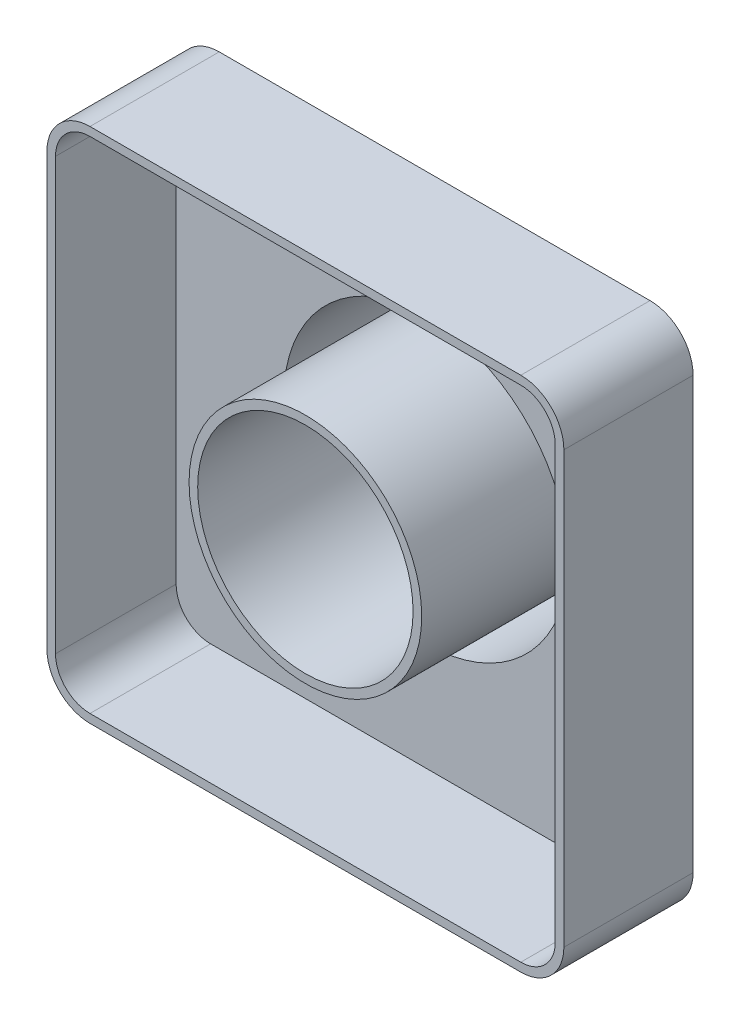
ISO-10303-21;
HEADER;
FILE_DESCRIPTION(('STEP AP214'),'2;1');
FILE_NAME('part.step','',(''),(''),'','','');
FILE_SCHEMA(('AUTOMOTIVE_DESIGN { 1 0 10303 214 1 1 1 1 }'));
ENDSEC;
DATA;
#1=APPLICATION_CONTEXT('core data for automotive mechanical design processes');
#2=APPLICATION_PROTOCOL_DEFINITION('international standard','automotive_design',2000,#1);
#3=PRODUCT_CONTEXT('',#1,'mechanical');
#4=PRODUCT('Part','Part','',(#3));
#5=PRODUCT_RELATED_PRODUCT_CATEGORY('part','',(#4));
#6=PRODUCT_DEFINITION_FORMATION('','',#4);
#7=PRODUCT_DEFINITION_CONTEXT('part definition',#1,'design');
#8=PRODUCT_DEFINITION('design','',#6,#7);
#9=PRODUCT_DEFINITION_SHAPE('','',#8);
#10=(LENGTH_UNIT() NAMED_UNIT(*) SI_UNIT(.MILLI.,.METRE.));
#11=(NAMED_UNIT(*) PLANE_ANGLE_UNIT() SI_UNIT($,.RADIAN.));
#12=(NAMED_UNIT(*) SI_UNIT($,.STERADIAN.) SOLID_ANGLE_UNIT());
#13=UNCERTAINTY_MEASURE_WITH_UNIT(LENGTH_MEASURE(1.E-05),#10,'distance_accuracy_value','');
#14=(GEOMETRIC_REPRESENTATION_CONTEXT(3) GLOBAL_UNCERTAINTY_ASSIGNED_CONTEXT((#13)) GLOBAL_UNIT_ASSIGNED_CONTEXT((#10,
#11,#12)) REPRESENTATION_CONTEXT('',''));
#15=CARTESIAN_POINT('',(0.,0.,0.));
#16=DIRECTION('',(0.,0.,1.));
#17=DIRECTION('',(1.,0.,0.));
#18=AXIS2_PLACEMENT_3D('',#15,#16,#17);
#19=CARTESIAN_POINT('',(0.,0.,30.));
#20=DIRECTION('',(0.,0.,-1.));
#21=DIRECTION('',(-1.,0.,0.));
#22=AXIS2_PLACEMENT_3D('',#19,#20,#21);
#23=PLANE('',#22);
#24=CARTESIAN_POINT('',(60.,60.,30.));
#25=DIRECTION('',(0.,0.,-1.));
#26=DIRECTION('',(-1.,0.,0.));
#27=AXIS2_PLACEMENT_3D('',#24,#25,#26);
#28=CIRCLE('',#27,27.);
#29=CARTESIAN_POINT('',(32.9999999999999,60.,30.));
#30=VERTEX_POINT('',#29);
#31=EDGE_CURVE('E206',#30,#30,#28,.T.);
#32=ORIENTED_EDGE('',*,*,#31,.F.);
#33=EDGE_LOOP('',(#32));
#34=FACE_BOUND('',#33,.T.);
#35=CARTESIAN_POINT('',(60.,60.,30.));
#36=DIRECTION('',(0.,0.,-1.));
#37=DIRECTION('',(-1.,0.,0.));
#38=AXIS2_PLACEMENT_3D('',#35,#36,#37);
#39=CIRCLE('',#38,25.);
#40=CARTESIAN_POINT('',(35.,60.,30.));
#41=VERTEX_POINT('',#40);
#42=EDGE_CURVE('E231',#41,#41,#39,.T.);
#43=ORIENTED_EDGE('',*,*,#42,.T.);
#44=EDGE_LOOP('',(#43));
#45=FACE_BOUND('',#44,.T.);
#46=ADVANCED_FACE('F39',(#34,#45),#23,.F.);
#47=CARTESIAN_POINT('',(0.,0.,30.));
#48=DIRECTION('',(1.,0.,0.));
#49=DIRECTION('',(0.,1.,0.));
#50=AXIS2_PLACEMENT_3D('',#47,#48,#49);
#51=PLANE('',#50);
#52=DIRECTION('',(0.,-1.,0.));
#53=VECTOR('',#52,1.);
#54=CARTESIAN_POINT('',(0.,0.,30.));
#55=LINE('',#54,#53);
#56=CARTESIAN_POINT('',(0.,110.,30.));
#57=VERTEX_POINT('',#56);
#58=CARTESIAN_POINT('',(0.,10.,30.));
#59=VERTEX_POINT('',#58);
#60=EDGE_CURVE('E245',#57,#59,#55,.T.);
#61=ORIENTED_EDGE('',*,*,#60,.F.);
#62=DIRECTION('',(0.,0.,-1.));
#63=VECTOR('',#62,1.);
#64=CARTESIAN_POINT('',(0.,110.,30.));
#65=LINE('',#64,#63);
#66=CARTESIAN_POINT('',(0.,110.,0.));
#67=VERTEX_POINT('',#66);
#68=EDGE_CURVE('E281',#57,#67,#65,.T.);
#69=ORIENTED_EDGE('',*,*,#68,.T.);
#70=DIRECTION('',(0.,-1.,0.));
#71=VECTOR('',#70,1.);
#72=CARTESIAN_POINT('',(0.,0.,0.));
#73=LINE('',#72,#71);
#74=CARTESIAN_POINT('',(0.,10.,0.));
#75=VERTEX_POINT('',#74);
#76=EDGE_CURVE('E241',#67,#75,#73,.T.);
#77=ORIENTED_EDGE('',*,*,#76,.T.);
#78=DIRECTION('',(0.,0.,-1.));
#79=VECTOR('',#78,1.);
#80=CARTESIAN_POINT('',(0.,10.,30.));
#81=LINE('',#80,#79);
#82=EDGE_CURVE('E261',#75,#59,#81,.F.);
#83=ORIENTED_EDGE('',*,*,#82,.T.);
#84=EDGE_LOOP('',(#61,#69,#77,#83));
#85=FACE_BOUND('',#84,.T.);
#86=ADVANCED_FACE('F396',(#85),#51,.F.);
#87=CARTESIAN_POINT('',(0.,0.,30.));
#88=DIRECTION('',(0.,1.,0.));
#89=DIRECTION('',(0.,0.,1.));
#90=AXIS2_PLACEMENT_3D('',#87,#88,#89);
#91=PLANE('',#90);
#92=DIRECTION('',(1.,0.,0.));
#93=VECTOR('',#92,1.);
#94=CARTESIAN_POINT('',(0.,0.,30.));
#95=LINE('',#94,#93);
#96=CARTESIAN_POINT('',(10.,0.,30.));
#97=VERTEX_POINT('',#96);
#98=CARTESIAN_POINT('',(110.,0.,30.));
#99=VERTEX_POINT('',#98);
#100=EDGE_CURVE('E249',#97,#99,#95,.T.);
#101=ORIENTED_EDGE('',*,*,#100,.F.);
#102=DIRECTION('',(0.,0.,-1.));
#103=VECTOR('',#102,1.);
#104=CARTESIAN_POINT('',(10.,0.,30.));
#105=LINE('',#104,#103);
#106=CARTESIAN_POINT('',(10.,0.,0.));
#107=VERTEX_POINT('',#106);
#108=EDGE_CURVE('E319',#97,#107,#105,.T.);
#109=ORIENTED_EDGE('',*,*,#108,.T.);
#110=DIRECTION('',(1.,0.,0.));
#111=VECTOR('',#110,1.);
#112=CARTESIAN_POINT('',(0.,0.,0.));
#113=LINE('',#112,#111);
#114=CARTESIAN_POINT('',(110.,0.,0.));
#115=VERTEX_POINT('',#114);
#116=EDGE_CURVE('E265',#107,#115,#113,.T.);
#117=ORIENTED_EDGE('',*,*,#116,.T.);
#118=DIRECTION('',(0.,0.,-1.));
#119=VECTOR('',#118,1.);
#120=CARTESIAN_POINT('',(110.,0.,30.));
#121=LINE('',#120,#119);
#122=EDGE_CURVE('E316',#115,#99,#121,.F.);
#123=ORIENTED_EDGE('',*,*,#122,.T.);
#124=EDGE_LOOP('',(#101,#109,#117,#123));
#125=FACE_BOUND('',#124,.T.);
#126=ADVANCED_FACE('F407',(#125),#91,.F.);
#127=CARTESIAN_POINT('',(120.,0.,30.));
#128=DIRECTION('',(-1.,0.,0.));
#129=DIRECTION('',(0.,-1.,0.));
#130=AXIS2_PLACEMENT_3D('',#127,#128,#129);
#131=PLANE('',#130);
#132=DIRECTION('',(0.,1.,0.));
#133=VECTOR('',#132,1.);
#134=CARTESIAN_POINT('',(120.,0.,30.));
#135=LINE('',#134,#133);
#136=CARTESIAN_POINT('',(120.,10.,30.));
#137=VERTEX_POINT('',#136);
#138=CARTESIAN_POINT('',(120.,110.,30.));
#139=VERTEX_POINT('',#138);
#140=EDGE_CURVE('E254',#137,#139,#135,.T.);
#141=ORIENTED_EDGE('',*,*,#140,.F.);
#142=DIRECTION('',(0.,0.,-1.));
#143=VECTOR('',#142,1.);
#144=CARTESIAN_POINT('',(120.,10.,30.));
#145=LINE('',#144,#143);
#146=CARTESIAN_POINT('',(120.,10.,0.));
#147=VERTEX_POINT('',#146);
#148=EDGE_CURVE('E11',#137,#147,#145,.T.);
#149=ORIENTED_EDGE('',*,*,#148,.T.);
#150=DIRECTION('',(0.,1.,0.));
#151=VECTOR('',#150,1.);
#152=CARTESIAN_POINT('',(120.,0.,0.));
#153=LINE('',#152,#151);
#154=CARTESIAN_POINT('',(120.,110.,0.));
#155=VERTEX_POINT('',#154);
#156=EDGE_CURVE('E269',#147,#155,#153,.T.);
#157=ORIENTED_EDGE('',*,*,#156,.T.);
#158=DIRECTION('',(0.,0.,-1.));
#159=VECTOR('',#158,1.);
#160=CARTESIAN_POINT('',(120.,110.,30.));
#161=LINE('',#160,#159);
#162=EDGE_CURVE('E48',#155,#139,#161,.F.);
#163=ORIENTED_EDGE('',*,*,#162,.T.);
#164=EDGE_LOOP('',(#141,#149,#157,#163));
#165=FACE_BOUND('',#164,.T.);
#166=ADVANCED_FACE('F414',(#165),#131,.F.);
#167=CARTESIAN_POINT('',(0.,120.,30.));
#168=DIRECTION('',(0.,-1.,0.));
#169=DIRECTION('',(0.,0.,-1.));
#170=AXIS2_PLACEMENT_3D('',#167,#168,#169);
#171=PLANE('',#170);
#172=DIRECTION('',(-1.,0.,0.));
#173=VECTOR('',#172,1.);
#174=CARTESIAN_POINT('',(0.,120.,0.));
#175=LINE('',#174,#173);
#176=CARTESIAN_POINT('',(110.,120.,0.));
#177=VERTEX_POINT('',#176);
#178=CARTESIAN_POINT('',(9.99999999999996,120.,0.));
#179=VERTEX_POINT('',#178);
#180=EDGE_CURVE('E250',#177,#179,#175,.T.);
#181=ORIENTED_EDGE('',*,*,#180,.T.);
#182=DIRECTION('',(0.,0.,-1.));
#183=VECTOR('',#182,1.);
#184=CARTESIAN_POINT('',(9.99999999999996,120.,30.));
#185=LINE('',#184,#183);
#186=CARTESIAN_POINT('',(9.99999999999996,120.,30.));
#187=VERTEX_POINT('',#186);
#188=EDGE_CURVE('E301',#179,#187,#185,.F.);
#189=ORIENTED_EDGE('',*,*,#188,.T.);
#190=DIRECTION('',(-1.,0.,0.));
#191=VECTOR('',#190,1.);
#192=CARTESIAN_POINT('',(0.,120.,30.));
#193=LINE('',#192,#191);
#194=CARTESIAN_POINT('',(110.,120.,30.));
#195=VERTEX_POINT('',#194);
#196=EDGE_CURVE('E257',#195,#187,#193,.T.);
#197=ORIENTED_EDGE('',*,*,#196,.F.);
#198=DIRECTION('',(0.,0.,-1.));
#199=VECTOR('',#198,1.);
#200=CARTESIAN_POINT('',(110.,120.,30.));
#201=LINE('',#200,#199);
#202=EDGE_CURVE('E297',#195,#177,#201,.T.);
#203=ORIENTED_EDGE('',*,*,#202,.T.);
#204=EDGE_LOOP('',(#181,#189,#197,#203));
#205=FACE_BOUND('',#204,.T.);
#206=ADVANCED_FACE('F382',(#205),#171,.F.);
#207=DIRECTION('',(-1.,0.,0.));
#208=VECTOR('',#207,1.);
#209=CARTESIAN_POINT('',(0.,118.,30.));
#210=LINE('',#209,#208);
#211=CARTESIAN_POINT('',(110.,118.,30.));
#212=VERTEX_POINT('',#211);
#213=CARTESIAN_POINT('',(9.99999999999996,118.,30.));
#214=VERTEX_POINT('',#213);
#215=EDGE_CURVE('E184',#212,#214,#210,.T.);
#216=ORIENTED_EDGE('',*,*,#215,.F.);
#217=CARTESIAN_POINT('',(110.,110.,30.));
#218=DIRECTION('',(0.,0.,-1.));
#219=DIRECTION('',(-1.,0.,0.));
#220=AXIS2_PLACEMENT_3D('',#217,#218,#219);
#221=CIRCLE('',#220,8.);
#222=CARTESIAN_POINT('',(118.,110.,30.));
#223=VERTEX_POINT('',#222);
#224=EDGE_CURVE('E187',#223,#212,#221,.F.);
#225=ORIENTED_EDGE('',*,*,#224,.F.);
#226=DIRECTION('',(0.,1.,0.));
#227=VECTOR('',#226,1.);
#228=CARTESIAN_POINT('',(118.,0.,30.));
#229=LINE('',#228,#227);
#230=CARTESIAN_POINT('',(118.,10.,30.));
#231=VERTEX_POINT('',#230);
#232=EDGE_CURVE('E55',#231,#223,#229,.T.);
#233=ORIENTED_EDGE('',*,*,#232,.F.);
#234=CARTESIAN_POINT('',(110.,10.,30.));
#235=DIRECTION('',(0.,0.,-1.));
#236=DIRECTION('',(-1.,0.,0.));
#237=AXIS2_PLACEMENT_3D('',#234,#235,#236);
#238=CIRCLE('',#237,8.);
#239=CARTESIAN_POINT('',(110.,2.,30.));
#240=VERTEX_POINT('',#239);
#241=EDGE_CURVE('E191',#240,#231,#238,.F.);
#242=ORIENTED_EDGE('',*,*,#241,.F.);
#243=DIRECTION('',(1.,0.,0.));
#244=VECTOR('',#243,1.);
#245=CARTESIAN_POINT('',(0.,2.,30.));
#246=LINE('',#245,#244);
#247=CARTESIAN_POINT('',(10.,2.,30.));
#248=VERTEX_POINT('',#247);
#249=EDGE_CURVE('E210',#248,#240,#246,.T.);
#250=ORIENTED_EDGE('',*,*,#249,.F.);
#251=CARTESIAN_POINT('',(10.,10.,30.));
#252=DIRECTION('',(0.,0.,-1.));
#253=DIRECTION('',(-1.,0.,0.));
#254=AXIS2_PLACEMENT_3D('',#251,#252,#253);
#255=CIRCLE('',#254,8.);
#256=CARTESIAN_POINT('',(2.,10.,30.));
#257=VERTEX_POINT('',#256);
#258=EDGE_CURVE('E211',#257,#248,#255,.F.);
#259=ORIENTED_EDGE('',*,*,#258,.F.);
#260=DIRECTION('',(0.,-1.,0.));
#261=VECTOR('',#260,1.);
#262=CARTESIAN_POINT('',(2.,0.,30.));
#263=LINE('',#262,#261);
#264=CARTESIAN_POINT('',(1.99999999999996,110.,30.));
#265=VERTEX_POINT('',#264);
#266=EDGE_CURVE('E179',#265,#257,#263,.T.);
#267=ORIENTED_EDGE('',*,*,#266,.F.);
#268=CARTESIAN_POINT('',(9.99999999999996,110.,30.));
#269=DIRECTION('',(0.,0.,-1.));
#270=DIRECTION('',(-1.,0.,0.));
#271=AXIS2_PLACEMENT_3D('',#268,#269,#270);
#272=CIRCLE('',#271,8.);
#273=EDGE_CURVE('E214',#214,#265,#272,.F.);
#274=ORIENTED_EDGE('',*,*,#273,.F.);
#275=EDGE_LOOP('',(#216,#225,#233,#242,#250,#259,#267,#274));
#276=FACE_BOUND('',#275,.T.);
#277=ORIENTED_EDGE('',*,*,#196,.T.);
#278=CARTESIAN_POINT('',(9.99999999999996,110.,30.));
#279=DIRECTION('',(0.,0.,-1.));
#280=DIRECTION('',(-1.,0.,0.));
#281=AXIS2_PLACEMENT_3D('',#278,#279,#280);
#282=CIRCLE('',#281,10.);
#283=EDGE_CURVE('E313',#187,#57,#282,.F.);
#284=ORIENTED_EDGE('',*,*,#283,.T.);
#285=ORIENTED_EDGE('',*,*,#60,.T.);
#286=CARTESIAN_POINT('',(10.,10.,30.));
#287=DIRECTION('',(0.,0.,-1.));
#288=DIRECTION('',(-1.,0.,0.));
#289=AXIS2_PLACEMENT_3D('',#286,#287,#288);
#290=CIRCLE('',#289,10.);
#291=EDGE_CURVE('E310',#59,#97,#290,.F.);
#292=ORIENTED_EDGE('',*,*,#291,.T.);
#293=ORIENTED_EDGE('',*,*,#100,.T.);
#294=CARTESIAN_POINT('',(110.,10.,30.));
#295=DIRECTION('',(0.,0.,-1.));
#296=DIRECTION('',(-1.,0.,0.));
#297=AXIS2_PLACEMENT_3D('',#294,#295,#296);
#298=CIRCLE('',#297,10.);
#299=EDGE_CURVE('E307',#99,#137,#298,.F.);
#300=ORIENTED_EDGE('',*,*,#299,.T.);
#301=ORIENTED_EDGE('',*,*,#140,.T.);
#302=CARTESIAN_POINT('',(110.,110.,30.));
#303=DIRECTION('',(0.,0.,-1.));
#304=DIRECTION('',(-1.,0.,0.));
#305=AXIS2_PLACEMENT_3D('',#302,#303,#304);
#306=CIRCLE('',#305,10.);
#307=EDGE_CURVE('E304',#139,#195,#306,.F.);
#308=ORIENTED_EDGE('',*,*,#307,.T.);
#309=EDGE_LOOP('',(#277,#284,#285,#292,#293,#300,#301,#308));
#310=FACE_BOUND('',#309,.T.);
#311=ADVANCED_FACE('F378',(#276,#310),#23,.F.);
#312=CARTESIAN_POINT('',(0.,0.,0.));
#313=DIRECTION('',(0.,0.,-1.));
#314=DIRECTION('',(-1.,0.,0.));
#315=AXIS2_PLACEMENT_3D('',#312,#313,#314);
#316=PLANE('',#315);
#317=CARTESIAN_POINT('',(60.,60.,0.));
#318=DIRECTION('',(0.,0.,1.));
#319=DIRECTION('',(1.,0.,0.));
#320=AXIS2_PLACEMENT_3D('',#317,#318,#319);
#321=CIRCLE('',#320,35.);
#322=CARTESIAN_POINT('',(94.9999999999999,60.,0.));
#323=VERTEX_POINT('',#322);
#324=EDGE_CURVE('E235',#323,#323,#321,.T.);
#325=ORIENTED_EDGE('',*,*,#324,.T.);
#326=EDGE_LOOP('',(#325));
#327=FACE_BOUND('',#326,.T.);
#328=ORIENTED_EDGE('',*,*,#76,.F.);
#329=CARTESIAN_POINT('',(9.99999999999996,110.,0.));
#330=DIRECTION('',(0.,0.,-1.));
#331=DIRECTION('',(-1.,0.,0.));
#332=AXIS2_PLACEMENT_3D('',#329,#330,#331);
#333=CIRCLE('',#332,10.);
#334=EDGE_CURVE('E294',#67,#179,#333,.T.);
#335=ORIENTED_EDGE('',*,*,#334,.T.);
#336=ORIENTED_EDGE('',*,*,#180,.F.);
#337=CARTESIAN_POINT('',(110.,110.,0.));
#338=DIRECTION('',(0.,0.,-1.));
#339=DIRECTION('',(-1.,0.,0.));
#340=AXIS2_PLACEMENT_3D('',#337,#338,#339);
#341=CIRCLE('',#340,10.);
#342=EDGE_CURVE('E285',#177,#155,#341,.T.);
#343=ORIENTED_EDGE('',*,*,#342,.T.);
#344=ORIENTED_EDGE('',*,*,#156,.F.);
#345=CARTESIAN_POINT('',(110.,10.,0.));
#346=DIRECTION('',(0.,0.,-1.));
#347=DIRECTION('',(-1.,0.,0.));
#348=AXIS2_PLACEMENT_3D('',#345,#346,#347);
#349=CIRCLE('',#348,10.);
#350=EDGE_CURVE('E288',#147,#115,#349,.T.);
#351=ORIENTED_EDGE('',*,*,#350,.T.);
#352=ORIENTED_EDGE('',*,*,#116,.F.);
#353=CARTESIAN_POINT('',(10.,10.,0.));
#354=DIRECTION('',(0.,0.,-1.));
#355=DIRECTION('',(-1.,0.,0.));
#356=AXIS2_PLACEMENT_3D('',#353,#354,#355);
#357=CIRCLE('',#356,10.);
#358=EDGE_CURVE('E291',#107,#75,#357,.T.);
#359=ORIENTED_EDGE('',*,*,#358,.T.);
#360=EDGE_LOOP('',(#328,#335,#336,#343,#344,#351,#352,#359));
#361=FACE_BOUND('',#360,.T.);
#362=ADVANCED_FACE('F381',(#327,#361),#316,.T.);
#363=CARTESIAN_POINT('',(60.,60.,-25.));
#364=DIRECTION('',(0.,0.,1.));
#365=DIRECTION('',(1.,0.,0.));
#366=AXIS2_PLACEMENT_3D('',#363,#364,#365);
#367=CYLINDRICAL_SURFACE('',#366,35.);
#368=CARTESIAN_POINT('',(60.,60.,-25.));
#369=DIRECTION('',(0.,0.,1.));
#370=DIRECTION('',(1.,0.,0.));
#371=AXIS2_PLACEMENT_3D('',#368,#369,#370);
#372=CIRCLE('',#371,35.);
#373=CARTESIAN_POINT('',(94.9999999999999,60.,-25.));
#374=VERTEX_POINT('',#373);
#375=EDGE_CURVE('E237',#374,#374,#372,.T.);
#376=ORIENTED_EDGE('',*,*,#375,.T.);
#377=EDGE_LOOP('',(#376));
#378=FACE_BOUND('',#377,.T.);
#379=ORIENTED_EDGE('',*,*,#324,.F.);
#380=EDGE_LOOP('',(#379));
#381=FACE_BOUND('',#380,.T.);
#382=ADVANCED_FACE('F432',(#378,#381),#367,.T.);
#383=CARTESIAN_POINT('',(60.,60.,-25.));
#384=DIRECTION('',(0.,0.,1.));
#385=DIRECTION('',(1.,0.,0.));
#386=AXIS2_PLACEMENT_3D('',#383,#384,#385);
#387=PLANE('',#386);
#388=CARTESIAN_POINT('',(60.,60.,-25.));
#389=DIRECTION('',(0.,0.,1.));
#390=DIRECTION('',(1.,0.,0.));
#391=AXIS2_PLACEMENT_3D('',#388,#389,#390);
#392=CIRCLE('',#391,25.);
#393=CARTESIAN_POINT('',(85.,60.,-25.));
#394=VERTEX_POINT('',#393);
#395=EDGE_CURVE('E236',#394,#394,#392,.T.);
#396=ORIENTED_EDGE('',*,*,#395,.T.);
#397=EDGE_LOOP('',(#396));
#398=FACE_BOUND('',#397,.T.);
#399=ORIENTED_EDGE('',*,*,#375,.F.);
#400=EDGE_LOOP('',(#399));
#401=FACE_BOUND('',#400,.T.);
#402=ADVANCED_FACE('F439',(#398,#401),#387,.F.);
#403=CARTESIAN_POINT('',(60.,60.,-67.));
#404=DIRECTION('',(0.,0.,1.));
#405=DIRECTION('',(1.,0.,0.));
#406=AXIS2_PLACEMENT_3D('',#403,#404,#405);
#407=CYLINDRICAL_SURFACE('',#406,25.);
#408=ORIENTED_EDGE('',*,*,#395,.F.);
#409=EDGE_LOOP('',(#408));
#410=FACE_BOUND('',#409,.T.);
#411=ORIENTED_EDGE('',*,*,#42,.F.);
#412=EDGE_LOOP('',(#411));
#413=FACE_BOUND('',#412,.T.);
#414=ADVANCED_FACE('F446',(#410,#413),#407,.F.);
#415=CARTESIAN_POINT('',(9.99999999999996,110.,30.));
#416=DIRECTION('',(0.,0.,-1.));
#417=DIRECTION('',(-1.,0.,0.));
#418=AXIS2_PLACEMENT_3D('',#415,#416,#417);
#419=CYLINDRICAL_SURFACE('',#418,10.);
#420=ORIENTED_EDGE('',*,*,#283,.F.);
#421=ORIENTED_EDGE('',*,*,#188,.F.);
#422=ORIENTED_EDGE('',*,*,#334,.F.);
#423=ORIENTED_EDGE('',*,*,#68,.F.);
#424=EDGE_LOOP('',(#420,#421,#422,#423));
#425=FACE_BOUND('',#424,.T.);
#426=ADVANCED_FACE('F393',(#425),#419,.T.);
#427=CARTESIAN_POINT('',(10.,10.,30.));
#428=DIRECTION('',(0.,0.,-1.));
#429=DIRECTION('',(-1.,0.,0.));
#430=AXIS2_PLACEMENT_3D('',#427,#428,#429);
#431=CYLINDRICAL_SURFACE('',#430,10.);
#432=ORIENTED_EDGE('',*,*,#291,.F.);
#433=ORIENTED_EDGE('',*,*,#82,.F.);
#434=ORIENTED_EDGE('',*,*,#358,.F.);
#435=ORIENTED_EDGE('',*,*,#108,.F.);
#436=EDGE_LOOP('',(#432,#433,#434,#435));
#437=FACE_BOUND('',#436,.T.);
#438=ADVANCED_FACE('F404',(#437),#431,.T.);
#439=CARTESIAN_POINT('',(110.,10.,30.));
#440=DIRECTION('',(0.,0.,-1.));
#441=DIRECTION('',(-1.,0.,0.));
#442=AXIS2_PLACEMENT_3D('',#439,#440,#441);
#443=CYLINDRICAL_SURFACE('',#442,10.);
#444=ORIENTED_EDGE('',*,*,#299,.F.);
#445=ORIENTED_EDGE('',*,*,#122,.F.);
#446=ORIENTED_EDGE('',*,*,#350,.F.);
#447=ORIENTED_EDGE('',*,*,#148,.F.);
#448=EDGE_LOOP('',(#444,#445,#446,#447));
#449=FACE_BOUND('',#448,.T.);
#450=ADVANCED_FACE('F412',(#449),#443,.T.);
#451=CARTESIAN_POINT('',(110.,110.,30.));
#452=DIRECTION('',(0.,0.,-1.));
#453=DIRECTION('',(-1.,0.,0.));
#454=AXIS2_PLACEMENT_3D('',#451,#452,#453);
#455=CYLINDRICAL_SURFACE('',#454,10.);
#456=ORIENTED_EDGE('',*,*,#307,.F.);
#457=ORIENTED_EDGE('',*,*,#162,.F.);
#458=ORIENTED_EDGE('',*,*,#342,.F.);
#459=ORIENTED_EDGE('',*,*,#202,.F.);
#460=EDGE_LOOP('',(#456,#457,#458,#459));
#461=FACE_BOUND('',#460,.T.);
#462=ADVANCED_FACE('F41',(#461),#455,.T.);
#463=CARTESIAN_POINT('',(2.,0.,30.));
#464=DIRECTION('',(1.,0.,0.));
#465=DIRECTION('',(0.,1.,0.));
#466=AXIS2_PLACEMENT_3D('',#463,#464,#465);
#467=PLANE('',#466);
#468=ORIENTED_EDGE('',*,*,#266,.T.);
#469=DIRECTION('',(0.,0.,1.));
#470=VECTOR('',#469,1.);
#471=CARTESIAN_POINT('',(2.,10.,30.));
#472=LINE('',#471,#470);
#473=CARTESIAN_POINT('',(2.,10.,2.));
#474=VERTEX_POINT('',#473);
#475=EDGE_CURVE('E224',#474,#257,#472,.T.);
#476=ORIENTED_EDGE('',*,*,#475,.F.);
#477=DIRECTION('',(0.,-1.,0.));
#478=VECTOR('',#477,1.);
#479=CARTESIAN_POINT('',(2.,0.,2.));
#480=LINE('',#479,#478);
#481=CARTESIAN_POINT('',(1.99999999999996,110.,2.));
#482=VERTEX_POINT('',#481);
#483=EDGE_CURVE('E200',#482,#474,#480,.T.);
#484=ORIENTED_EDGE('',*,*,#483,.F.);
#485=DIRECTION('',(0.,0.,1.));
#486=VECTOR('',#485,1.);
#487=CARTESIAN_POINT('',(1.99999999999996,110.,30.));
#488=LINE('',#487,#486);
#489=EDGE_CURVE('E162',#265,#482,#488,.F.);
#490=ORIENTED_EDGE('',*,*,#489,.F.);
#491=EDGE_LOOP('',(#468,#476,#484,#490));
#492=FACE_BOUND('',#491,.T.);
#493=ADVANCED_FACE('F360',(#492),#467,.T.);
#494=CARTESIAN_POINT('',(0.,2.,30.));
#495=DIRECTION('',(0.,1.,0.));
#496=DIRECTION('',(0.,0.,1.));
#497=AXIS2_PLACEMENT_3D('',#494,#495,#496);
#498=PLANE('',#497);
#499=ORIENTED_EDGE('',*,*,#249,.T.);
#500=DIRECTION('',(0.,0.,1.));
#501=VECTOR('',#500,1.);
#502=CARTESIAN_POINT('',(110.,2.,30.));
#503=LINE('',#502,#501);
#504=CARTESIAN_POINT('',(110.,2.,2.));
#505=VERTEX_POINT('',#504);
#506=EDGE_CURVE('E227',#505,#240,#503,.T.);
#507=ORIENTED_EDGE('',*,*,#506,.F.);
#508=DIRECTION('',(1.,0.,0.));
#509=VECTOR('',#508,1.);
#510=CARTESIAN_POINT('',(0.,2.,2.));
#511=LINE('',#510,#509);
#512=CARTESIAN_POINT('',(10.,2.,2.));
#513=VERTEX_POINT('',#512);
#514=EDGE_CURVE('E340',#513,#505,#511,.T.);
#515=ORIENTED_EDGE('',*,*,#514,.F.);
#516=DIRECTION('',(0.,0.,1.));
#517=VECTOR('',#516,1.);
#518=CARTESIAN_POINT('',(10.,2.,30.));
#519=LINE('',#518,#517);
#520=EDGE_CURVE('E329',#248,#513,#519,.F.);
#521=ORIENTED_EDGE('',*,*,#520,.F.);
#522=EDGE_LOOP('',(#499,#507,#515,#521));
#523=FACE_BOUND('',#522,.T.);
#524=ADVANCED_FACE('F369',(#523),#498,.T.);
#525=CARTESIAN_POINT('',(118.,0.,30.));
#526=DIRECTION('',(-1.,0.,0.));
#527=DIRECTION('',(0.,-1.,0.));
#528=AXIS2_PLACEMENT_3D('',#525,#526,#527);
#529=PLANE('',#528);
#530=ORIENTED_EDGE('',*,*,#232,.T.);
#531=DIRECTION('',(0.,0.,1.));
#532=VECTOR('',#531,1.);
#533=CARTESIAN_POINT('',(118.,110.,30.));
#534=LINE('',#533,#532);
#535=CARTESIAN_POINT('',(118.,110.,2.));
#536=VERTEX_POINT('',#535);
#537=EDGE_CURVE('E326',#536,#223,#534,.T.);
#538=ORIENTED_EDGE('',*,*,#537,.F.);
#539=DIRECTION('',(0.,1.,0.));
#540=VECTOR('',#539,1.);
#541=CARTESIAN_POINT('',(118.,0.,2.));
#542=LINE('',#541,#540);
#543=CARTESIAN_POINT('',(118.,10.,2.));
#544=VERTEX_POINT('',#543);
#545=EDGE_CURVE('E180',#544,#536,#542,.T.);
#546=ORIENTED_EDGE('',*,*,#545,.F.);
#547=DIRECTION('',(0.,0.,1.));
#548=VECTOR('',#547,1.);
#549=CARTESIAN_POINT('',(118.,10.,30.));
#550=LINE('',#549,#548);
#551=EDGE_CURVE('E278',#231,#544,#550,.F.);
#552=ORIENTED_EDGE('',*,*,#551,.F.);
#553=EDGE_LOOP('',(#530,#538,#546,#552));
#554=FACE_BOUND('',#553,.T.);
#555=ADVANCED_FACE('F373',(#554),#529,.T.);
#556=CARTESIAN_POINT('',(0.,118.,30.));
#557=DIRECTION('',(0.,-1.,0.));
#558=DIRECTION('',(0.,0.,-1.));
#559=AXIS2_PLACEMENT_3D('',#556,#557,#558);
#560=PLANE('',#559);
#561=DIRECTION('',(-1.,0.,0.));
#562=VECTOR('',#561,1.);
#563=CARTESIAN_POINT('',(0.,118.,2.));
#564=LINE('',#563,#562);
#565=CARTESIAN_POINT('',(110.,118.,2.));
#566=VERTEX_POINT('',#565);
#567=CARTESIAN_POINT('',(9.99999999999996,118.,2.));
#568=VERTEX_POINT('',#567);
#569=EDGE_CURVE('E171',#566,#568,#564,.T.);
#570=ORIENTED_EDGE('',*,*,#569,.F.);
#571=DIRECTION('',(0.,0.,-1.));
#572=VECTOR('',#571,1.);
#573=CARTESIAN_POINT('',(110.,118.,30.));
#574=LINE('',#573,#572);
#575=EDGE_CURVE('E167',#212,#566,#574,.T.);
#576=ORIENTED_EDGE('',*,*,#575,.F.);
#577=ORIENTED_EDGE('',*,*,#215,.T.);
#578=DIRECTION('',(0.,0.,-1.));
#579=VECTOR('',#578,1.);
#580=CARTESIAN_POINT('',(9.99999999999996,118.,30.));
#581=LINE('',#580,#579);
#582=EDGE_CURVE('E159',#568,#214,#581,.F.);
#583=ORIENTED_EDGE('',*,*,#582,.F.);
#584=EDGE_LOOP('',(#570,#576,#577,#583));
#585=FACE_BOUND('',#584,.T.);
#586=ADVANCED_FACE('F182',(#585),#560,.T.);
#587=CARTESIAN_POINT('',(0.,0.,2.));
#588=DIRECTION('',(0.,0.,-1.));
#589=DIRECTION('',(-1.,0.,0.));
#590=AXIS2_PLACEMENT_3D('',#587,#588,#589);
#591=PLANE('',#590);
#592=CARTESIAN_POINT('',(60.,60.,2.));
#593=DIRECTION('',(0.,0.,-1.));
#594=DIRECTION('',(-1.,0.,0.));
#595=AXIS2_PLACEMENT_3D('',#592,#593,#594);
#596=CIRCLE('',#595,33.);
#597=CARTESIAN_POINT('',(27.,60.,2.));
#598=VERTEX_POINT('',#597);
#599=EDGE_CURVE('E201',#598,#598,#596,.F.);
#600=ORIENTED_EDGE('',*,*,#599,.F.);
#601=EDGE_LOOP('',(#600));
#602=FACE_BOUND('',#601,.T.);
#603=ORIENTED_EDGE('',*,*,#483,.T.);
#604=CARTESIAN_POINT('',(10.,10.,2.));
#605=DIRECTION('',(0.,0.,-1.));
#606=DIRECTION('',(-1.,0.,0.));
#607=AXIS2_PLACEMENT_3D('',#604,#605,#606);
#608=CIRCLE('',#607,8.);
#609=EDGE_CURVE('E168',#513,#474,#608,.T.);
#610=ORIENTED_EDGE('',*,*,#609,.F.);
#611=ORIENTED_EDGE('',*,*,#514,.T.);
#612=CARTESIAN_POINT('',(110.,10.,2.));
#613=DIRECTION('',(0.,0.,-1.));
#614=DIRECTION('',(-1.,0.,0.));
#615=AXIS2_PLACEMENT_3D('',#612,#613,#614);
#616=CIRCLE('',#615,8.);
#617=EDGE_CURVE('E339',#544,#505,#616,.T.);
#618=ORIENTED_EDGE('',*,*,#617,.F.);
#619=ORIENTED_EDGE('',*,*,#545,.T.);
#620=CARTESIAN_POINT('',(110.,110.,2.));
#621=DIRECTION('',(0.,0.,-1.));
#622=DIRECTION('',(-1.,0.,0.));
#623=AXIS2_PLACEMENT_3D('',#620,#621,#622);
#624=CIRCLE('',#623,8.);
#625=EDGE_CURVE('E174',#566,#536,#624,.T.);
#626=ORIENTED_EDGE('',*,*,#625,.F.);
#627=ORIENTED_EDGE('',*,*,#569,.T.);
#628=CARTESIAN_POINT('',(9.99999999999996,110.,2.));
#629=DIRECTION('',(0.,0.,-1.));
#630=DIRECTION('',(-1.,0.,0.));
#631=AXIS2_PLACEMENT_3D('',#628,#629,#630);
#632=CIRCLE('',#631,8.);
#633=EDGE_CURVE('E155',#482,#568,#632,.T.);
#634=ORIENTED_EDGE('',*,*,#633,.F.);
#635=EDGE_LOOP('',(#603,#610,#611,#618,#619,#626,#627,#634));
#636=FACE_BOUND('',#635,.T.);
#637=ADVANCED_FACE('F172',(#602,#636),#591,.F.);
#638=CARTESIAN_POINT('',(60.,60.,-25.));
#639=DIRECTION('',(0.,0.,1.));
#640=DIRECTION('',(1.,0.,0.));
#641=AXIS2_PLACEMENT_3D('',#638,#639,#640);
#642=CYLINDRICAL_SURFACE('',#641,33.);
#643=CARTESIAN_POINT('',(60.,60.,-23.));
#644=DIRECTION('',(0.,0.,1.));
#645=DIRECTION('',(1.,0.,0.));
#646=AXIS2_PLACEMENT_3D('',#643,#644,#645);
#647=CIRCLE('',#646,33.);
#648=CARTESIAN_POINT('',(92.9999999999999,60.,-23.));
#649=VERTEX_POINT('',#648);
#650=EDGE_CURVE('E196',#649,#649,#647,.T.);
#651=ORIENTED_EDGE('',*,*,#650,.F.);
#652=EDGE_LOOP('',(#651));
#653=FACE_BOUND('',#652,.T.);
#654=ORIENTED_EDGE('',*,*,#599,.T.);
#655=EDGE_LOOP('',(#654));
#656=FACE_BOUND('',#655,.T.);
#657=ADVANCED_FACE('F471',(#653,#656),#642,.F.);
#658=CARTESIAN_POINT('',(60.,60.,-23.));
#659=DIRECTION('',(0.,0.,1.));
#660=DIRECTION('',(1.,0.,0.));
#661=AXIS2_PLACEMENT_3D('',#658,#659,#660);
#662=PLANE('',#661);
#663=CARTESIAN_POINT('',(60.,60.,-23.));
#664=DIRECTION('',(0.,0.,1.));
#665=DIRECTION('',(1.,0.,0.));
#666=AXIS2_PLACEMENT_3D('',#663,#664,#665);
#667=CIRCLE('',#666,27.);
#668=CARTESIAN_POINT('',(87.,60.,-23.));
#669=VERTEX_POINT('',#668);
#670=EDGE_CURVE('E202',#669,#669,#667,.T.);
#671=ORIENTED_EDGE('',*,*,#670,.F.);
#672=EDGE_LOOP('',(#671));
#673=FACE_BOUND('',#672,.T.);
#674=ORIENTED_EDGE('',*,*,#650,.T.);
#675=EDGE_LOOP('',(#674));
#676=FACE_BOUND('',#675,.T.);
#677=ADVANCED_FACE('F467',(#673,#676),#662,.T.);
#678=CARTESIAN_POINT('',(60.,60.,-67.));
#679=DIRECTION('',(0.,0.,1.));
#680=DIRECTION('',(1.,0.,0.));
#681=AXIS2_PLACEMENT_3D('',#678,#679,#680);
#682=CYLINDRICAL_SURFACE('',#681,27.);
#683=ORIENTED_EDGE('',*,*,#670,.T.);
#684=EDGE_LOOP('',(#683));
#685=FACE_BOUND('',#684,.T.);
#686=ORIENTED_EDGE('',*,*,#31,.T.);
#687=EDGE_LOOP('',(#686));
#688=FACE_BOUND('',#687,.T.);
#689=ADVANCED_FACE('F464',(#685,#688),#682,.T.);
#690=CARTESIAN_POINT('',(9.99999999999996,110.,30.));
#691=DIRECTION('',(0.,0.,-1.));
#692=DIRECTION('',(-1.,0.,0.));
#693=AXIS2_PLACEMENT_3D('',#690,#691,#692);
#694=CYLINDRICAL_SURFACE('',#693,8.);
#695=ORIENTED_EDGE('',*,*,#273,.T.);
#696=ORIENTED_EDGE('',*,*,#489,.T.);
#697=ORIENTED_EDGE('',*,*,#633,.T.);
#698=ORIENTED_EDGE('',*,*,#582,.T.);
#699=EDGE_LOOP('',(#695,#696,#697,#698));
#700=FACE_BOUND('',#699,.T.);
#701=ADVANCED_FACE('F157',(#700),#694,.F.);
#702=CARTESIAN_POINT('',(10.,10.,30.));
#703=DIRECTION('',(0.,0.,-1.));
#704=DIRECTION('',(-1.,0.,0.));
#705=AXIS2_PLACEMENT_3D('',#702,#703,#704);
#706=CYLINDRICAL_SURFACE('',#705,8.);
#707=ORIENTED_EDGE('',*,*,#258,.T.);
#708=ORIENTED_EDGE('',*,*,#520,.T.);
#709=ORIENTED_EDGE('',*,*,#609,.T.);
#710=ORIENTED_EDGE('',*,*,#475,.T.);
#711=EDGE_LOOP('',(#707,#708,#709,#710));
#712=FACE_BOUND('',#711,.T.);
#713=ADVANCED_FACE('F364',(#712),#706,.F.);
#714=CARTESIAN_POINT('',(110.,10.,30.));
#715=DIRECTION('',(0.,0.,-1.));
#716=DIRECTION('',(-1.,0.,0.));
#717=AXIS2_PLACEMENT_3D('',#714,#715,#716);
#718=CYLINDRICAL_SURFACE('',#717,8.);
#719=ORIENTED_EDGE('',*,*,#241,.T.);
#720=ORIENTED_EDGE('',*,*,#551,.T.);
#721=ORIENTED_EDGE('',*,*,#617,.T.);
#722=ORIENTED_EDGE('',*,*,#506,.T.);
#723=EDGE_LOOP('',(#719,#720,#721,#722));
#724=FACE_BOUND('',#723,.T.);
#725=ADVANCED_FACE('F371',(#724),#718,.F.);
#726=CARTESIAN_POINT('',(110.,110.,30.));
#727=DIRECTION('',(0.,0.,-1.));
#728=DIRECTION('',(-1.,0.,0.));
#729=AXIS2_PLACEMENT_3D('',#726,#727,#728);
#730=CYLINDRICAL_SURFACE('',#729,8.);
#731=ORIENTED_EDGE('',*,*,#224,.T.);
#732=ORIENTED_EDGE('',*,*,#575,.T.);
#733=ORIENTED_EDGE('',*,*,#625,.T.);
#734=ORIENTED_EDGE('',*,*,#537,.T.);
#735=EDGE_LOOP('',(#731,#732,#733,#734));
#736=FACE_BOUND('',#735,.T.);
#737=ADVANCED_FACE('F376',(#736),#730,.F.);
#738=CLOSED_SHELL('',(#46,#86,#126,#166,#206,#311,#362,#382,#402,#414,#426,#438,#450,#462,#493,
#524,#555,#586,#637,#657,#677,#689,#701,#713,#725,#737));
#739=MANIFOLD_SOLID_BREP('B2',#738);
#740=ADVANCED_BREP_SHAPE_REPRESENTATION('',(#18,#739),#14);
#741=SHAPE_DEFINITION_REPRESENTATION(#9,#740);
ENDSEC;
END-ISO-10303-21;
